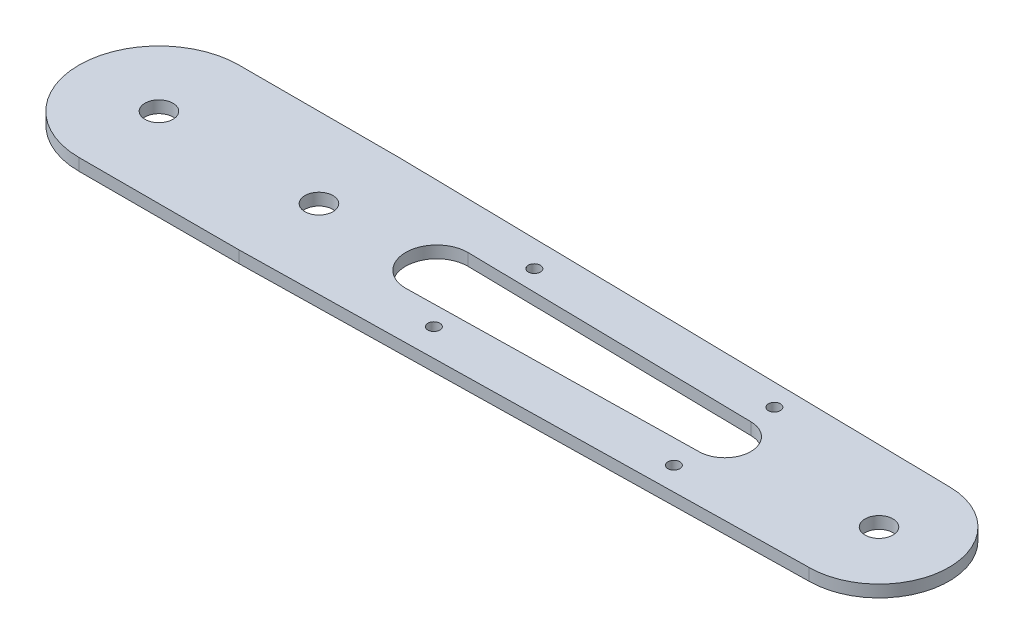
ISO-10303-21;
HEADER;
FILE_DESCRIPTION(('STEP AP214'),'2;1');
FILE_NAME('part.step','',(''),(''),'','','');
FILE_SCHEMA(('AUTOMOTIVE_DESIGN { 1 0 10303 214 1 1 1 1 }'));
ENDSEC;
DATA;
#1=APPLICATION_CONTEXT('core data for automotive mechanical design processes');
#2=APPLICATION_PROTOCOL_DEFINITION('international standard','automotive_design',2000,#1);
#3=PRODUCT_CONTEXT('',#1,'mechanical');
#4=PRODUCT('Part','Part','',(#3));
#5=PRODUCT_RELATED_PRODUCT_CATEGORY('part','',(#4));
#6=PRODUCT_DEFINITION_FORMATION('','',#4);
#7=PRODUCT_DEFINITION_CONTEXT('part definition',#1,'design');
#8=PRODUCT_DEFINITION('design','',#6,#7);
#9=PRODUCT_DEFINITION_SHAPE('','',#8);
#10=(LENGTH_UNIT() NAMED_UNIT(*) SI_UNIT(.MILLI.,.METRE.));
#11=(NAMED_UNIT(*) PLANE_ANGLE_UNIT() SI_UNIT($,.RADIAN.));
#12=(NAMED_UNIT(*) SI_UNIT($,.STERADIAN.) SOLID_ANGLE_UNIT());
#13=UNCERTAINTY_MEASURE_WITH_UNIT(LENGTH_MEASURE(1.E-05),#10,'distance_accuracy_value','');
#14=(GEOMETRIC_REPRESENTATION_CONTEXT(3) GLOBAL_UNCERTAINTY_ASSIGNED_CONTEXT((#13)) GLOBAL_UNIT_ASSIGNED_CONTEXT((#10,
#11,#12)) REPRESENTATION_CONTEXT('',''));
#15=CARTESIAN_POINT('',(0.,0.,0.));
#16=DIRECTION('',(0.,0.,1.));
#17=DIRECTION('',(1.,0.,0.));
#18=AXIS2_PLACEMENT_3D('',#15,#16,#17);
#19=CARTESIAN_POINT('',(0.,3.,0.));
#20=DIRECTION('',(0.,1.,0.));
#21=DIRECTION('',(0.,0.,1.));
#22=AXIS2_PLACEMENT_3D('',#19,#20,#21);
#23=PLANE('',#22);
#24=CARTESIAN_POINT('',(100.994069634501,3.,-12.8483172188178));
#25=DIRECTION('',(0.,1.,0.));
#26=DIRECTION('',(0.,0.,-1.));
#27=AXIS2_PLACEMENT_3D('',#24,#25,#26);
#28=CIRCLE('',#27,1.50000000000001);
#29=CARTESIAN_POINT('',(100.994069634501,3.,-14.3483172188178));
#30=VERTEX_POINT('',#29);
#31=EDGE_CURVE('E486',#30,#30,#28,.T.);
#32=ORIENTED_EDGE('',*,*,#31,.F.);
#33=EDGE_LOOP('',(#32));
#34=FACE_BOUND('',#33,.T.);
#35=CARTESIAN_POINT('',(100.994069634501,3.,12.2668470597705));
#36=DIRECTION('',(0.,1.,0.));
#37=DIRECTION('',(0.,0.,-1.));
#38=AXIS2_PLACEMENT_3D('',#35,#36,#37);
#39=CIRCLE('',#38,1.50000000000001);
#40=CARTESIAN_POINT('',(100.994069634501,3.,10.7668470597705));
#41=VERTEX_POINT('',#40);
#42=EDGE_CURVE('E482',#41,#41,#39,.T.);
#43=ORIENTED_EDGE('',*,*,#42,.F.);
#44=EDGE_LOOP('',(#43));
#45=FACE_BOUND('',#44,.T.);
#46=CARTESIAN_POINT('',(40.9940696345014,3.,12.2668470597705));
#47=DIRECTION('',(0.,1.,0.));
#48=DIRECTION('',(0.,0.,1.));
#49=AXIS2_PLACEMENT_3D('',#46,#47,#48);
#50=CIRCLE('',#49,1.5);
#51=CARTESIAN_POINT('',(40.9940696345014,3.,13.7668470597705));
#52=VERTEX_POINT('',#51);
#53=EDGE_CURVE('E475',#52,#52,#50,.T.);
#54=ORIENTED_EDGE('',*,*,#53,.F.);
#55=EDGE_LOOP('',(#54));
#56=FACE_BOUND('',#55,.T.);
#57=CARTESIAN_POINT('',(40.9940696345014,3.,-12.8483172188178));
#58=DIRECTION('',(0.,1.,0.));
#59=DIRECTION('',(0.,0.,1.));
#60=AXIS2_PLACEMENT_3D('',#57,#58,#59);
#61=CIRCLE('',#60,1.5);
#62=CARTESIAN_POINT('',(40.9940696345014,3.,-11.3483172188178));
#63=VERTEX_POINT('',#62);
#64=EDGE_CURVE('E237',#63,#63,#61,.T.);
#65=ORIENTED_EDGE('',*,*,#64,.F.);
#66=EDGE_LOOP('',(#65));
#67=FACE_BOUND('',#66,.T.);
#68=CARTESIAN_POINT('',(0.,3.,0.));
#69=DIRECTION('',(0.,1.,0.));
#70=DIRECTION('',(0.,0.,1.));
#71=AXIS2_PLACEMENT_3D('',#68,#69,#70);
#72=CIRCLE('',#71,3.5);
#73=CARTESIAN_POINT('',(0.,3.,3.5));
#74=VERTEX_POINT('',#73);
#75=EDGE_CURVE('E199',#74,#74,#72,.T.);
#76=ORIENTED_EDGE('',*,*,#75,.F.);
#77=EDGE_LOOP('',(#76));
#78=FACE_BOUND('',#77,.T.);
#79=CARTESIAN_POINT('',(140.,3.,0.));
#80=DIRECTION('',(0.,1.,0.));
#81=DIRECTION('',(0.,0.,1.));
#82=AXIS2_PLACEMENT_3D('',#79,#80,#81);
#83=CIRCLE('',#82,3.49999999999999);
#84=CARTESIAN_POINT('',(140.,3.,3.49999999999999));
#85=VERTEX_POINT('',#84);
#86=EDGE_CURVE('E189',#85,#85,#83,.T.);
#87=ORIENTED_EDGE('',*,*,#86,.F.);
#88=EDGE_LOOP('',(#87));
#89=FACE_BOUND('',#88,.T.);
#90=DIRECTION('',(-0.999840599345445,0.,0.0178542964168829));
#91=VECTOR('',#90,1.);
#92=CARTESIAN_POINT('',(0.357029008606949,3.,19.9936244819892));
#93=LINE('',#92,#91);
#94=CARTESIAN_POINT('',(140.,3.,17.5));
#95=VERTEX_POINT('',#94);
#96=CARTESIAN_POINT('',(0.,3.,20.));
#97=VERTEX_POINT('',#96);
#98=EDGE_CURVE('E207',#95,#97,#93,.T.);
#99=ORIENTED_EDGE('',*,*,#98,.F.);
#100=CARTESIAN_POINT('',(140.,3.,0.));
#101=DIRECTION('',(0.,1.,0.));
#102=DIRECTION('',(0.,0.,1.));
#103=AXIS2_PLACEMENT_3D('',#100,#101,#102);
#104=CIRCLE('',#103,17.5);
#105=CARTESIAN_POINT('',(140.3125,3.,-17.4972095989618));
#106=VERTEX_POINT('',#105);
#107=EDGE_CURVE('E210',#95,#106,#104,.T.);
#108=ORIENTED_EDGE('',*,*,#107,.T.);
#109=DIRECTION('',(0.999840548512101,0.,0.0178571428571428));
#110=VECTOR('',#109,1.);
#111=CARTESIAN_POINT('',(0.357142857142856,3.,-19.996810970242));
#112=LINE('',#111,#110);
#113=CARTESIAN_POINT('',(0.357142857142857,3.,-19.996810970242));
#114=VERTEX_POINT('',#113);
#115=EDGE_CURVE('E213',#114,#106,#112,.T.);
#116=ORIENTED_EDGE('',*,*,#115,.F.);
#117=CARTESIAN_POINT('',(0.,3.,0.));
#118=DIRECTION('',(0.,1.,0.));
#119=DIRECTION('',(0.,0.,1.));
#120=AXIS2_PLACEMENT_3D('',#117,#118,#119);
#121=CIRCLE('',#120,20.);
#122=CARTESIAN_POINT('',(-0.353982548441951,3.,-19.9968671635184));
#123=VERTEX_POINT('',#122);
#124=EDGE_CURVE('E216',#114,#123,#121,.T.);
#125=ORIENTED_EDGE('',*,*,#124,.T.);
#126=DIRECTION('',(-0.999999996877904,0.,-7.90202061454945E-05));
#127=VECTOR('',#126,1.);
#128=CARTESIAN_POINT('',(0.00158015435025654,3.,-19.9968390668802));
#129=LINE('',#128,#127);
#130=CARTESIAN_POINT('',(-40.,3.,-20.));
#131=VERTEX_POINT('',#130);
#132=EDGE_CURVE('E161',#123,#131,#129,.T.);
#133=ORIENTED_EDGE('',*,*,#132,.T.);
#134=CARTESIAN_POINT('',(-40.,3.,0.));
#135=DIRECTION('',(0.,1.,0.));
#136=DIRECTION('',(0.,0.,1.));
#137=AXIS2_PLACEMENT_3D('',#134,#135,#136);
#138=CIRCLE('',#137,19.999999968779);
#139=CARTESIAN_POINT('',(-40.,3.,20.));
#140=VERTEX_POINT('',#139);
#141=EDGE_CURVE('E130',#131,#140,#138,.T.);
#142=ORIENTED_EDGE('',*,*,#141,.T.);
#143=DIRECTION('',(1.,0.,0.));
#144=VECTOR('',#143,1.);
#145=CARTESIAN_POINT('',(0.,3.,20.));
#146=LINE('',#145,#144);
#147=EDGE_CURVE('E153',#140,#97,#146,.T.);
#148=ORIENTED_EDGE('',*,*,#147,.T.);
#149=EDGE_LOOP('',(#99,#108,#116,#125,#133,#142,#148));
#150=FACE_BOUND('',#149,.T.);
#151=DIRECTION('',(-0.999840548512101,0.,-0.0178571428571486));
#152=VECTOR('',#151,1.);
#153=CARTESIAN_POINT('',(0.153184026665754,3.,-8.57693766970494));
#154=LINE('',#153,#152);
#155=CARTESIAN_POINT('',(101.283865866767,3.,-6.77074463667885));
#156=VERTEX_POINT('',#155);
#157=CARTESIAN_POINT('',(29.1730446968037,3.,-8.05864322920403));
#158=VERTEX_POINT('',#157);
#159=EDGE_CURVE('E179',#156,#158,#154,.T.);
#160=ORIENTED_EDGE('',*,*,#159,.F.);
#161=CARTESIAN_POINT('',(101.157834128344,3.,-0.288766187509077));
#162=DIRECTION('',(0.,1.,0.));
#163=DIRECTION('',(0.,0.,1.));
#164=AXIS2_PLACEMENT_3D('',#161,#162,#163);
#165=CIRCLE('',#164,6.48320357651921);
#166=CARTESIAN_POINT('',(101.494647455368,3.,6.18568246834806));
#167=VERTEX_POINT('',#166);
#168=EDGE_CURVE('E58',#156,#167,#165,.F.);
#169=ORIENTED_EDGE('',*,*,#168,.T.);
#170=DIRECTION('',(0.999840599345445,0.,-0.0178542964168771));
#171=VECTOR('',#170,1.);
#172=CARTESIAN_POINT('',(0.142777451604297,3.,7.99553728984324));
#173=LINE('',#172,#171);
#174=CARTESIAN_POINT('',(29.1575998035354,3.,7.47741546213036));
#175=VERTEX_POINT('',#174);
#176=EDGE_CURVE('E170',#175,#167,#173,.T.);
#177=ORIENTED_EDGE('',*,*,#176,.F.);
#178=CARTESIAN_POINT('',(29.1653222501695,3.,-0.290613883536413));
#179=DIRECTION('',(0.,1.,0.));
#180=DIRECTION('',(0.,0.,1.));
#181=AXIS2_PLACEMENT_3D('',#178,#179,#180);
#182=CIRCLE('',#181,7.76803318423194);
#183=EDGE_CURVE('E182',#158,#175,#182,.T.);
#184=ORIENTED_EDGE('',*,*,#183,.F.);
#185=EDGE_LOOP('',(#160,#169,#177,#184));
#186=FACE_BOUND('',#185,.T.);
#187=CARTESIAN_POINT('',(-40.,3.,0.));
#188=DIRECTION('',(0.,1.,0.));
#189=DIRECTION('',(0.,0.,1.));
#190=AXIS2_PLACEMENT_3D('',#187,#188,#189);
#191=CIRCLE('',#190,3.5);
#192=CARTESIAN_POINT('',(-40.,3.,3.5));
#193=VERTEX_POINT('',#192);
#194=EDGE_CURVE('E158',#193,#193,#191,.T.);
#195=ORIENTED_EDGE('',*,*,#194,.F.);
#196=EDGE_LOOP('',(#195));
#197=FACE_BOUND('',#196,.T.);
#198=ADVANCED_FACE('F41',(#34,#45,#56,#67,#78,#89,#150,#186,#197),#23,.T.);
#199=CARTESIAN_POINT('',(0.,0.,0.));
#200=DIRECTION('',(0.,1.,0.));
#201=DIRECTION('',(0.,0.,1.));
#202=AXIS2_PLACEMENT_3D('',#199,#200,#201);
#203=PLANE('',#202);
#204=CARTESIAN_POINT('',(100.994069634501,0.,-12.8483172188178));
#205=DIRECTION('',(0.,1.,0.));
#206=DIRECTION('',(0.,0.,1.));
#207=AXIS2_PLACEMENT_3D('',#204,#205,#206);
#208=CIRCLE('',#207,1.50000000000001);
#209=CARTESIAN_POINT('',(100.994069634501,0.,-11.3483172188178));
#210=VERTEX_POINT('',#209);
#211=EDGE_CURVE('E45',#210,#210,#208,.T.);
#212=ORIENTED_EDGE('',*,*,#211,.T.);
#213=EDGE_LOOP('',(#212));
#214=FACE_BOUND('',#213,.T.);
#215=CARTESIAN_POINT('',(100.994069634501,0.,12.2668470597705));
#216=DIRECTION('',(0.,1.,0.));
#217=DIRECTION('',(0.,0.,1.));
#218=AXIS2_PLACEMENT_3D('',#215,#216,#217);
#219=CIRCLE('',#218,1.50000000000001);
#220=CARTESIAN_POINT('',(100.994069634501,0.,13.7668470597705));
#221=VERTEX_POINT('',#220);
#222=EDGE_CURVE('E239',#221,#221,#219,.T.);
#223=ORIENTED_EDGE('',*,*,#222,.T.);
#224=EDGE_LOOP('',(#223));
#225=FACE_BOUND('',#224,.T.);
#226=CARTESIAN_POINT('',(40.9940696345014,0.,12.2668470597705));
#227=DIRECTION('',(0.,1.,0.));
#228=DIRECTION('',(0.,0.,1.));
#229=AXIS2_PLACEMENT_3D('',#226,#227,#228);
#230=CIRCLE('',#229,1.5);
#231=CARTESIAN_POINT('',(40.9940696345014,0.,13.7668470597705));
#232=VERTEX_POINT('',#231);
#233=EDGE_CURVE('E236',#232,#232,#230,.T.);
#234=ORIENTED_EDGE('',*,*,#233,.T.);
#235=EDGE_LOOP('',(#234));
#236=FACE_BOUND('',#235,.T.);
#237=CARTESIAN_POINT('',(40.9940696345014,0.,-12.8483172188178));
#238=DIRECTION('',(0.,1.,0.));
#239=DIRECTION('',(0.,0.,1.));
#240=AXIS2_PLACEMENT_3D('',#237,#238,#239);
#241=CIRCLE('',#240,1.5);
#242=CARTESIAN_POINT('',(40.9940696345014,0.,-11.3483172188178));
#243=VERTEX_POINT('',#242);
#244=EDGE_CURVE('E233',#243,#243,#241,.T.);
#245=ORIENTED_EDGE('',*,*,#244,.T.);
#246=EDGE_LOOP('',(#245));
#247=FACE_BOUND('',#246,.T.);
#248=DIRECTION('',(-0.999840599345445,0.,0.0178542964168829));
#249=VECTOR('',#248,1.);
#250=CARTESIAN_POINT('',(0.357029008606949,0.,19.9936244819892));
#251=LINE('',#250,#249);
#252=CARTESIAN_POINT('',(140.,0.,17.5));
#253=VERTEX_POINT('',#252);
#254=CARTESIAN_POINT('',(0.,0.,20.));
#255=VERTEX_POINT('',#254);
#256=EDGE_CURVE('E198',#253,#255,#251,.T.);
#257=ORIENTED_EDGE('',*,*,#256,.T.);
#258=DIRECTION('',(1.,0.,0.));
#259=VECTOR('',#258,1.);
#260=CARTESIAN_POINT('',(0.,0.,20.));
#261=LINE('',#260,#259);
#262=CARTESIAN_POINT('',(-40.,0.,20.));
#263=VERTEX_POINT('',#262);
#264=EDGE_CURVE('E135',#263,#255,#261,.T.);
#265=ORIENTED_EDGE('',*,*,#264,.F.);
#266=CARTESIAN_POINT('',(-40.,0.,0.));
#267=DIRECTION('',(0.,1.,0.));
#268=DIRECTION('',(0.,0.,1.));
#269=AXIS2_PLACEMENT_3D('',#266,#267,#268);
#270=CIRCLE('',#269,19.999999968779);
#271=CARTESIAN_POINT('',(-40.,0.,-20.));
#272=VERTEX_POINT('',#271);
#273=EDGE_CURVE('E128',#272,#263,#270,.T.);
#274=ORIENTED_EDGE('',*,*,#273,.F.);
#275=DIRECTION('',(-0.999999996877904,0.,-7.90202061454945E-05));
#276=VECTOR('',#275,1.);
#277=CARTESIAN_POINT('',(0.00158015435025654,0.,-19.9968390668802));
#278=LINE('',#277,#276);
#279=CARTESIAN_POINT('',(-0.353982548441951,0.,-19.9968671635184));
#280=VERTEX_POINT('',#279);
#281=EDGE_CURVE('E144',#280,#272,#278,.T.);
#282=ORIENTED_EDGE('',*,*,#281,.F.);
#283=CARTESIAN_POINT('',(0.,0.,0.));
#284=DIRECTION('',(0.,1.,0.));
#285=DIRECTION('',(0.,0.,1.));
#286=AXIS2_PLACEMENT_3D('',#283,#284,#285);
#287=CIRCLE('',#286,20.);
#288=CARTESIAN_POINT('',(0.357142857142857,0.,-19.996810970242));
#289=VERTEX_POINT('',#288);
#290=EDGE_CURVE('E211',#289,#280,#287,.T.);
#291=ORIENTED_EDGE('',*,*,#290,.F.);
#292=DIRECTION('',(0.999840548512101,0.,0.0178571428571428));
#293=VECTOR('',#292,1.);
#294=CARTESIAN_POINT('',(0.357142857142856,0.,-19.996810970242));
#295=LINE('',#294,#293);
#296=CARTESIAN_POINT('',(140.3125,0.,-17.4972095989618));
#297=VERTEX_POINT('',#296);
#298=EDGE_CURVE('E224',#289,#297,#295,.T.);
#299=ORIENTED_EDGE('',*,*,#298,.T.);
#300=CARTESIAN_POINT('',(140.,0.,0.));
#301=DIRECTION('',(0.,1.,0.));
#302=DIRECTION('',(0.,0.,1.));
#303=AXIS2_PLACEMENT_3D('',#300,#301,#302);
#304=CIRCLE('',#303,17.5);
#305=EDGE_CURVE('E221',#253,#297,#304,.T.);
#306=ORIENTED_EDGE('',*,*,#305,.F.);
#307=EDGE_LOOP('',(#257,#265,#274,#282,#291,#299,#306));
#308=FACE_BOUND('',#307,.T.);
#309=CARTESIAN_POINT('',(140.,0.,0.));
#310=DIRECTION('',(0.,1.,0.));
#311=DIRECTION('',(0.,0.,1.));
#312=AXIS2_PLACEMENT_3D('',#309,#310,#311);
#313=CIRCLE('',#312,3.49999999999999);
#314=CARTESIAN_POINT('',(140.,0.,3.49999999999999));
#315=VERTEX_POINT('',#314);
#316=EDGE_CURVE('E202',#315,#315,#313,.T.);
#317=ORIENTED_EDGE('',*,*,#316,.T.);
#318=EDGE_LOOP('',(#317));
#319=FACE_BOUND('',#318,.T.);
#320=CARTESIAN_POINT('',(0.,0.,0.));
#321=DIRECTION('',(0.,1.,0.));
#322=DIRECTION('',(0.,0.,1.));
#323=AXIS2_PLACEMENT_3D('',#320,#321,#322);
#324=CIRCLE('',#323,3.5);
#325=CARTESIAN_POINT('',(0.,0.,3.5));
#326=VERTEX_POINT('',#325);
#327=EDGE_CURVE('E195',#326,#326,#324,.T.);
#328=ORIENTED_EDGE('',*,*,#327,.T.);
#329=EDGE_LOOP('',(#328));
#330=FACE_BOUND('',#329,.T.);
#331=CARTESIAN_POINT('',(101.157834128344,0.,-0.288766187509077));
#332=DIRECTION('',(0.,1.,0.));
#333=DIRECTION('',(0.,0.,1.));
#334=AXIS2_PLACEMENT_3D('',#331,#332,#333);
#335=CIRCLE('',#334,6.48320357651921);
#336=CARTESIAN_POINT('',(101.283865866767,0.,-6.77074463667885));
#337=VERTEX_POINT('',#336);
#338=CARTESIAN_POINT('',(101.494647455368,0.,6.18568246834806));
#339=VERTEX_POINT('',#338);
#340=EDGE_CURVE('E167',#337,#339,#335,.F.);
#341=ORIENTED_EDGE('',*,*,#340,.F.);
#342=DIRECTION('',(-0.999840548512101,0.,-0.0178571428571486));
#343=VECTOR('',#342,1.);
#344=CARTESIAN_POINT('',(0.153184026665754,0.,-8.57693766970494));
#345=LINE('',#344,#343);
#346=CARTESIAN_POINT('',(29.1730446968037,0.,-8.05864322920403));
#347=VERTEX_POINT('',#346);
#348=EDGE_CURVE('E169',#337,#347,#345,.T.);
#349=ORIENTED_EDGE('',*,*,#348,.T.);
#350=CARTESIAN_POINT('',(29.1653222501695,0.,-0.290613883536413));
#351=DIRECTION('',(0.,1.,0.));
#352=DIRECTION('',(0.,0.,1.));
#353=AXIS2_PLACEMENT_3D('',#350,#351,#352);
#354=CIRCLE('',#353,7.76803318423194);
#355=CARTESIAN_POINT('',(29.1575998035354,0.,7.47741546213036));
#356=VERTEX_POINT('',#355);
#357=EDGE_CURVE('E66',#347,#356,#354,.T.);
#358=ORIENTED_EDGE('',*,*,#357,.T.);
#359=DIRECTION('',(0.999840599345445,0.,-0.0178542964168771));
#360=VECTOR('',#359,1.);
#361=CARTESIAN_POINT('',(0.142777451604297,0.,7.99553728984324));
#362=LINE('',#361,#360);
#363=EDGE_CURVE('E174',#356,#339,#362,.T.);
#364=ORIENTED_EDGE('',*,*,#363,.T.);
#365=EDGE_LOOP('',(#341,#349,#358,#364));
#366=FACE_BOUND('',#365,.T.);
#367=CARTESIAN_POINT('',(-40.,0.,0.));
#368=DIRECTION('',(0.,1.,0.));
#369=DIRECTION('',(0.,0.,1.));
#370=AXIS2_PLACEMENT_3D('',#367,#368,#369);
#371=CIRCLE('',#370,3.5);
#372=CARTESIAN_POINT('',(-40.,0.,3.5));
#373=VERTEX_POINT('',#372);
#374=EDGE_CURVE('E150',#373,#373,#371,.T.);
#375=ORIENTED_EDGE('',*,*,#374,.T.);
#376=EDGE_LOOP('',(#375));
#377=FACE_BOUND('',#376,.T.);
#378=ADVANCED_FACE('F141',(#214,#225,#236,#247,#308,#319,#330,#366,#377),#203,.F.);
#379=CARTESIAN_POINT('',(0.357029008606949,3.,19.9936244819892));
#380=DIRECTION('',(0.0178542964168829,0.,0.999840599345445));
#381=DIRECTION('',(0.999840599345445,0.,-0.0178542964168829));
#382=AXIS2_PLACEMENT_3D('',#379,#380,#381);
#383=PLANE('',#382);
#384=ORIENTED_EDGE('',*,*,#256,.F.);
#385=DIRECTION('',(0.,-1.,0.));
#386=VECTOR('',#385,1.);
#387=CARTESIAN_POINT('',(140.,3.,17.5));
#388=LINE('',#387,#386);
#389=EDGE_CURVE('E12',#95,#253,#388,.T.);
#390=ORIENTED_EDGE('',*,*,#389,.F.);
#391=ORIENTED_EDGE('',*,*,#98,.T.);
#392=DIRECTION('',(0.,-1.,0.));
#393=VECTOR('',#392,1.);
#394=CARTESIAN_POINT('',(0.,3.,20.));
#395=LINE('',#394,#393);
#396=EDGE_CURVE('E219',#97,#255,#395,.T.);
#397=ORIENTED_EDGE('',*,*,#396,.T.);
#398=EDGE_LOOP('',(#384,#390,#391,#397));
#399=FACE_BOUND('',#398,.T.);
#400=ADVANCED_FACE('F43',(#399),#383,.T.);
#401=CARTESIAN_POINT('',(140.,3.,0.));
#402=DIRECTION('',(0.,-1.,0.));
#403=DIRECTION('',(0.,0.,-1.));
#404=AXIS2_PLACEMENT_3D('',#401,#402,#403);
#405=CYLINDRICAL_SURFACE('',#404,17.5);
#406=ORIENTED_EDGE('',*,*,#305,.T.);
#407=DIRECTION('',(0.,-1.,0.));
#408=VECTOR('',#407,1.);
#409=CARTESIAN_POINT('',(140.3125,3.,-17.4972095989618));
#410=LINE('',#409,#408);
#411=EDGE_CURVE('E50',#106,#297,#410,.T.);
#412=ORIENTED_EDGE('',*,*,#411,.F.);
#413=ORIENTED_EDGE('',*,*,#107,.F.);
#414=ORIENTED_EDGE('',*,*,#389,.T.);
#415=EDGE_LOOP('',(#406,#412,#413,#414));
#416=FACE_BOUND('',#415,.T.);
#417=ADVANCED_FACE('F279',(#416),#405,.T.);
#418=CARTESIAN_POINT('',(0.357142857142856,3.,-19.996810970242));
#419=DIRECTION('',(0.0178571428571428,0.,-0.999840548512101));
#420=DIRECTION('',(-0.999840548512101,0.,-0.0178571428571428));
#421=AXIS2_PLACEMENT_3D('',#418,#419,#420);
#422=PLANE('',#421);
#423=ORIENTED_EDGE('',*,*,#298,.F.);
#424=DIRECTION('',(0.,-1.,0.));
#425=VECTOR('',#424,1.);
#426=CARTESIAN_POINT('',(0.357142857142857,3.,-19.996810970242));
#427=LINE('',#426,#425);
#428=EDGE_CURVE('E230',#114,#289,#427,.T.);
#429=ORIENTED_EDGE('',*,*,#428,.F.);
#430=ORIENTED_EDGE('',*,*,#115,.T.);
#431=ORIENTED_EDGE('',*,*,#411,.T.);
#432=EDGE_LOOP('',(#423,#429,#430,#431));
#433=FACE_BOUND('',#432,.T.);
#434=ADVANCED_FACE('F276',(#433),#422,.T.);
#435=CARTESIAN_POINT('',(0.,3.,0.));
#436=DIRECTION('',(0.,-1.,0.));
#437=DIRECTION('',(0.,0.,-1.));
#438=AXIS2_PLACEMENT_3D('',#435,#436,#437);
#439=CYLINDRICAL_SURFACE('',#438,20.);
#440=ORIENTED_EDGE('',*,*,#290,.T.);
#441=DIRECTION('',(0.,1.,0.));
#442=VECTOR('',#441,1.);
#443=CARTESIAN_POINT('',(-0.353982548441951,0.,-19.9968671635184));
#444=LINE('',#443,#442);
#445=EDGE_CURVE('E149',#280,#123,#444,.T.);
#446=ORIENTED_EDGE('',*,*,#445,.T.);
#447=ORIENTED_EDGE('',*,*,#124,.F.);
#448=ORIENTED_EDGE('',*,*,#428,.T.);
#449=EDGE_LOOP('',(#440,#446,#447,#448));
#450=FACE_BOUND('',#449,.T.);
#451=ADVANCED_FACE('F273',(#450),#439,.T.);
#452=CARTESIAN_POINT('',(140.,0.,0.));
#453=DIRECTION('',(0.,1.,0.));
#454=DIRECTION('',(0.,0.,1.));
#455=AXIS2_PLACEMENT_3D('',#452,#453,#454);
#456=CYLINDRICAL_SURFACE('',#455,3.49999999999999);
#457=ORIENTED_EDGE('',*,*,#316,.F.);
#458=EDGE_LOOP('',(#457));
#459=FACE_BOUND('',#458,.T.);
#460=ORIENTED_EDGE('',*,*,#86,.T.);
#461=EDGE_LOOP('',(#460));
#462=FACE_BOUND('',#461,.T.);
#463=ADVANCED_FACE('F270',(#459,#462),#456,.F.);
#464=CARTESIAN_POINT('',(0.,0.,0.));
#465=DIRECTION('',(0.,1.,0.));
#466=DIRECTION('',(0.,0.,1.));
#467=AXIS2_PLACEMENT_3D('',#464,#465,#466);
#468=CYLINDRICAL_SURFACE('',#467,3.5);
#469=ORIENTED_EDGE('',*,*,#327,.F.);
#470=EDGE_LOOP('',(#469));
#471=FACE_BOUND('',#470,.T.);
#472=ORIENTED_EDGE('',*,*,#75,.T.);
#473=EDGE_LOOP('',(#472));
#474=FACE_BOUND('',#473,.T.);
#475=ADVANCED_FACE('F328',(#471,#474),#468,.F.);
#476=CARTESIAN_POINT('',(101.157834128344,0.,-0.288766187509077));
#477=DIRECTION('',(0.,1.,0.));
#478=DIRECTION('',(0.,0.,1.));
#479=AXIS2_PLACEMENT_3D('',#476,#477,#478);
#480=CYLINDRICAL_SURFACE('',#479,6.48320357651921);
#481=ORIENTED_EDGE('',*,*,#168,.F.);
#482=DIRECTION('',(0.,1.,0.));
#483=VECTOR('',#482,1.);
#484=CARTESIAN_POINT('',(101.283865866767,0.,-6.77074463667885));
#485=LINE('',#484,#483);
#486=EDGE_CURVE('E177',#337,#156,#485,.T.);
#487=ORIENTED_EDGE('',*,*,#486,.F.);
#488=ORIENTED_EDGE('',*,*,#340,.T.);
#489=DIRECTION('',(0.,1.,0.));
#490=VECTOR('',#489,1.);
#491=CARTESIAN_POINT('',(101.494647455368,0.,6.18568246834806));
#492=LINE('',#491,#490);
#493=EDGE_CURVE('E187',#339,#167,#492,.T.);
#494=ORIENTED_EDGE('',*,*,#493,.T.);
#495=EDGE_LOOP('',(#481,#487,#488,#494));
#496=FACE_BOUND('',#495,.T.);
#497=ADVANCED_FACE('F320',(#496),#480,.F.);
#498=CARTESIAN_POINT('',(0.142777451604297,0.,7.99553728984324));
#499=DIRECTION('',(0.0178542964168771,0.,0.999840599345445));
#500=DIRECTION('',(0.999840599345445,0.,-0.0178542964168771));
#501=AXIS2_PLACEMENT_3D('',#498,#499,#500);
#502=PLANE('',#501);
#503=ORIENTED_EDGE('',*,*,#176,.T.);
#504=ORIENTED_EDGE('',*,*,#493,.F.);
#505=ORIENTED_EDGE('',*,*,#363,.F.);
#506=DIRECTION('',(0.,1.,0.));
#507=VECTOR('',#506,1.);
#508=CARTESIAN_POINT('',(29.1575998035354,0.,7.47741546213036));
#509=LINE('',#508,#507);
#510=EDGE_CURVE('E190',#356,#175,#509,.T.);
#511=ORIENTED_EDGE('',*,*,#510,.T.);
#512=EDGE_LOOP('',(#503,#504,#505,#511));
#513=FACE_BOUND('',#512,.T.);
#514=ADVANCED_FACE('F316',(#513),#502,.F.);
#515=CARTESIAN_POINT('',(29.1653222501695,0.,-0.290613883536413));
#516=DIRECTION('',(0.,1.,0.));
#517=DIRECTION('',(0.,0.,1.));
#518=AXIS2_PLACEMENT_3D('',#515,#516,#517);
#519=CYLINDRICAL_SURFACE('',#518,7.76803318423194);
#520=ORIENTED_EDGE('',*,*,#183,.T.);
#521=ORIENTED_EDGE('',*,*,#510,.F.);
#522=ORIENTED_EDGE('',*,*,#357,.F.);
#523=DIRECTION('',(0.,1.,0.));
#524=VECTOR('',#523,1.);
#525=CARTESIAN_POINT('',(29.1730446968037,0.,-8.05864322920403));
#526=LINE('',#525,#524);
#527=EDGE_CURVE('E192',#347,#158,#526,.T.);
#528=ORIENTED_EDGE('',*,*,#527,.T.);
#529=EDGE_LOOP('',(#520,#521,#522,#528));
#530=FACE_BOUND('',#529,.T.);
#531=ADVANCED_FACE('F319',(#530),#519,.F.);
#532=CARTESIAN_POINT('',(0.153184026665754,0.,-8.57693766970494));
#533=DIRECTION('',(0.0178571428571486,0.,-0.999840548512101));
#534=DIRECTION('',(-0.999840548512101,0.,-0.0178571428571486));
#535=AXIS2_PLACEMENT_3D('',#532,#533,#534);
#536=PLANE('',#535);
#537=ORIENTED_EDGE('',*,*,#159,.T.);
#538=ORIENTED_EDGE('',*,*,#527,.F.);
#539=ORIENTED_EDGE('',*,*,#348,.F.);
#540=ORIENTED_EDGE('',*,*,#486,.T.);
#541=EDGE_LOOP('',(#537,#538,#539,#540));
#542=FACE_BOUND('',#541,.T.);
#543=ADVANCED_FACE('F310',(#542),#536,.F.);
#544=CARTESIAN_POINT('',(0.00158015435025654,0.,-19.9968390668802));
#545=DIRECTION('',(7.90202061454945E-05,0.,-0.999999996877903));
#546=DIRECTION('',(-0.999999996877904,0.,-7.90202061454945E-05));
#547=AXIS2_PLACEMENT_3D('',#544,#545,#546);
#548=PLANE('',#547);
#549=ORIENTED_EDGE('',*,*,#132,.F.);
#550=ORIENTED_EDGE('',*,*,#445,.F.);
#551=ORIENTED_EDGE('',*,*,#281,.T.);
#552=DIRECTION('',(0.,1.,0.));
#553=VECTOR('',#552,1.);
#554=CARTESIAN_POINT('',(-40.,0.,-20.));
#555=LINE('',#554,#553);
#556=EDGE_CURVE('E125',#272,#131,#555,.T.);
#557=ORIENTED_EDGE('',*,*,#556,.T.);
#558=EDGE_LOOP('',(#549,#550,#551,#557));
#559=FACE_BOUND('',#558,.T.);
#560=ADVANCED_FACE('F147',(#559),#548,.T.);
#561=CARTESIAN_POINT('',(0.,0.,20.));
#562=DIRECTION('',(0.,0.,1.));
#563=DIRECTION('',(1.,0.,0.));
#564=AXIS2_PLACEMENT_3D('',#561,#562,#563);
#565=PLANE('',#564);
#566=ORIENTED_EDGE('',*,*,#147,.F.);
#567=DIRECTION('',(0.,1.,0.));
#568=VECTOR('',#567,1.);
#569=CARTESIAN_POINT('',(-40.,0.,20.));
#570=LINE('',#569,#568);
#571=EDGE_CURVE('E134',#263,#140,#570,.T.);
#572=ORIENTED_EDGE('',*,*,#571,.F.);
#573=ORIENTED_EDGE('',*,*,#264,.T.);
#574=ORIENTED_EDGE('',*,*,#396,.F.);
#575=EDGE_LOOP('',(#566,#572,#573,#574));
#576=FACE_BOUND('',#575,.T.);
#577=ADVANCED_FACE('F300',(#576),#565,.T.);
#578=CARTESIAN_POINT('',(-40.,0.,0.));
#579=DIRECTION('',(0.,1.,0.));
#580=DIRECTION('',(0.,0.,1.));
#581=AXIS2_PLACEMENT_3D('',#578,#579,#580);
#582=CYLINDRICAL_SURFACE('',#581,3.5);
#583=ORIENTED_EDGE('',*,*,#374,.F.);
#584=EDGE_LOOP('',(#583));
#585=FACE_BOUND('',#584,.T.);
#586=ORIENTED_EDGE('',*,*,#194,.T.);
#587=EDGE_LOOP('',(#586));
#588=FACE_BOUND('',#587,.T.);
#589=ADVANCED_FACE('F302',(#585,#588),#582,.F.);
#590=CARTESIAN_POINT('',(-40.,0.,0.));
#591=DIRECTION('',(0.,1.,0.));
#592=DIRECTION('',(0.,0.,1.));
#593=AXIS2_PLACEMENT_3D('',#590,#591,#592);
#594=CYLINDRICAL_SURFACE('',#593,19.999999968779);
#595=ORIENTED_EDGE('',*,*,#141,.F.);
#596=ORIENTED_EDGE('',*,*,#556,.F.);
#597=ORIENTED_EDGE('',*,*,#273,.T.);
#598=ORIENTED_EDGE('',*,*,#571,.T.);
#599=EDGE_LOOP('',(#595,#596,#597,#598));
#600=FACE_BOUND('',#599,.T.);
#601=ADVANCED_FACE('F127',(#600),#594,.T.);
#602=CARTESIAN_POINT('',(40.9940696345014,-7.,-12.8483172188178));
#603=DIRECTION('',(0.,1.,0.));
#604=DIRECTION('',(0.,0.,1.));
#605=AXIS2_PLACEMENT_3D('',#602,#603,#604);
#606=CYLINDRICAL_SURFACE('',#605,1.5);
#607=ORIENTED_EDGE('',*,*,#64,.T.);
#608=EDGE_LOOP('',(#607));
#609=FACE_BOUND('',#608,.T.);
#610=ORIENTED_EDGE('',*,*,#244,.F.);
#611=EDGE_LOOP('',(#610));
#612=FACE_BOUND('',#611,.T.);
#613=ADVANCED_FACE('F313',(#609,#612),#606,.F.);
#614=CARTESIAN_POINT('',(40.9940696345014,-7.,12.2668470597705));
#615=DIRECTION('',(0.,1.,0.));
#616=DIRECTION('',(0.,0.,1.));
#617=AXIS2_PLACEMENT_3D('',#614,#615,#616);
#618=CYLINDRICAL_SURFACE('',#617,1.5);
#619=ORIENTED_EDGE('',*,*,#53,.T.);
#620=EDGE_LOOP('',(#619));
#621=FACE_BOUND('',#620,.T.);
#622=ORIENTED_EDGE('',*,*,#233,.F.);
#623=EDGE_LOOP('',(#622));
#624=FACE_BOUND('',#623,.T.);
#625=ADVANCED_FACE('F255',(#621,#624),#618,.F.);
#626=CARTESIAN_POINT('',(100.994069634501,-7.,12.2668470597705));
#627=DIRECTION('',(0.,1.,0.));
#628=DIRECTION('',(0.,0.,1.));
#629=AXIS2_PLACEMENT_3D('',#626,#627,#628);
#630=CYLINDRICAL_SURFACE('',#629,1.50000000000001);
#631=ORIENTED_EDGE('',*,*,#42,.T.);
#632=EDGE_LOOP('',(#631));
#633=FACE_BOUND('',#632,.T.);
#634=ORIENTED_EDGE('',*,*,#222,.F.);
#635=EDGE_LOOP('',(#634));
#636=FACE_BOUND('',#635,.T.);
#637=ADVANCED_FACE('F249',(#633,#636),#630,.F.);
#638=CARTESIAN_POINT('',(100.994069634501,-7.,-12.8483172188178));
#639=DIRECTION('',(0.,1.,0.));
#640=DIRECTION('',(0.,0.,1.));
#641=AXIS2_PLACEMENT_3D('',#638,#639,#640);
#642=CYLINDRICAL_SURFACE('',#641,1.50000000000001);
#643=ORIENTED_EDGE('',*,*,#31,.T.);
#644=EDGE_LOOP('',(#643));
#645=FACE_BOUND('',#644,.T.);
#646=ORIENTED_EDGE('',*,*,#211,.F.);
#647=EDGE_LOOP('',(#646));
#648=FACE_BOUND('',#647,.T.);
#649=ADVANCED_FACE('F247',(#645,#648),#642,.F.);
#650=CLOSED_SHELL('',(#198,#378,#400,#417,#434,#451,#463,#475,#497,#514,#531,#543,#560,#577,
#589,#601,#613,#625,#637,#649));
#651=MANIFOLD_SOLID_BREP('B2',#650);
#652=ADVANCED_BREP_SHAPE_REPRESENTATION('',(#18,#651),#14);
#653=SHAPE_DEFINITION_REPRESENTATION(#9,#652);
ENDSEC;
END-ISO-10303-21;
